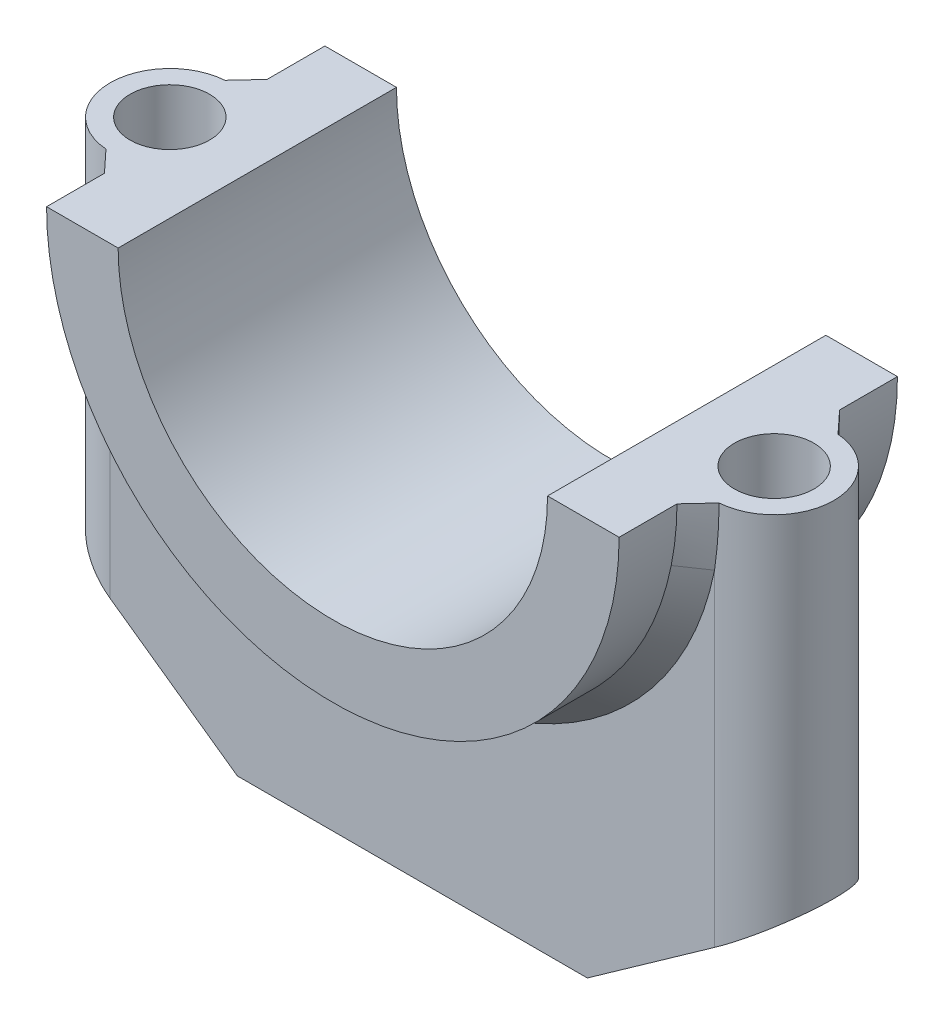
ISO-10303-21;
HEADER;
FILE_DESCRIPTION(('STEP AP214'),'2;1');
FILE_NAME('part.step','',(''),(''),'','','');
FILE_SCHEMA(('AUTOMOTIVE_DESIGN { 1 0 10303 214 1 1 1 1 }'));
ENDSEC;
DATA;
#1=APPLICATION_CONTEXT('core data for automotive mechanical design processes');
#2=APPLICATION_PROTOCOL_DEFINITION('international standard','automotive_design',2000,#1);
#3=PRODUCT_CONTEXT('',#1,'mechanical');
#4=PRODUCT('Part','Part','',(#3));
#5=PRODUCT_RELATED_PRODUCT_CATEGORY('part','',(#4));
#6=PRODUCT_DEFINITION_FORMATION('','',#4);
#7=PRODUCT_DEFINITION_CONTEXT('part definition',#1,'design');
#8=PRODUCT_DEFINITION('design','',#6,#7);
#9=PRODUCT_DEFINITION_SHAPE('','',#8);
#10=(LENGTH_UNIT() NAMED_UNIT(*) SI_UNIT(.MILLI.,.METRE.));
#11=(NAMED_UNIT(*) PLANE_ANGLE_UNIT() SI_UNIT($,.RADIAN.));
#12=(NAMED_UNIT(*) SI_UNIT($,.STERADIAN.) SOLID_ANGLE_UNIT());
#13=UNCERTAINTY_MEASURE_WITH_UNIT(LENGTH_MEASURE(1.E-05),#10,'distance_accuracy_value','');
#14=(GEOMETRIC_REPRESENTATION_CONTEXT(3) GLOBAL_UNCERTAINTY_ASSIGNED_CONTEXT((#13)) GLOBAL_UNIT_ASSIGNED_CONTEXT((#10,
#11,#12)) REPRESENTATION_CONTEXT('',''));
#15=CARTESIAN_POINT('',(0.,0.,0.));
#16=DIRECTION('',(0.,0.,1.));
#17=DIRECTION('',(1.,0.,0.));
#18=AXIS2_PLACEMENT_3D('',#15,#16,#17);
#19=CARTESIAN_POINT('',(0.,-59.7222410364215,7.5));
#20=DIRECTION('',(0.,1.,0.));
#21=DIRECTION('',(0.,0.,1.));
#22=AXIS2_PLACEMENT_3D('',#19,#20,#21);
#23=PLANE('',#22);
#24=DIRECTION('',(1.,0.,0.));
#25=VECTOR('',#24,1.);
#26=CARTESIAN_POINT('',(0.,-59.7222410364215,-7.5));
#27=LINE('',#26,#25);
#28=CARTESIAN_POINT('',(-58.7629469453342,-59.7222410364217,-7.5));
#29=VERTEX_POINT('',#28);
#30=CARTESIAN_POINT('',(-14.7629469453346,-59.7222410364215,-7.5));
#31=VERTEX_POINT('',#30);
#32=EDGE_CURVE('E174',#29,#31,#27,.T.);
#33=ORIENTED_EDGE('',*,*,#32,.T.);
#34=DIRECTION('',(0.,0.,1.));
#35=VECTOR('',#34,1.);
#36=CARTESIAN_POINT('',(-14.7629469453346,-59.7222410364215,-17.5));
#37=LINE('',#36,#35);
#38=CARTESIAN_POINT('',(-14.7629469453346,-59.7222410364215,7.5));
#39=VERTEX_POINT('',#38);
#40=EDGE_CURVE('E177',#31,#39,#37,.T.);
#41=ORIENTED_EDGE('',*,*,#40,.T.);
#42=DIRECTION('',(1.,0.,0.));
#43=VECTOR('',#42,1.);
#44=CARTESIAN_POINT('',(0.,-59.7222410364215,7.5));
#45=LINE('',#44,#43);
#46=CARTESIAN_POINT('',(-58.7629469453342,-59.7222410364217,7.5));
#47=VERTEX_POINT('',#46);
#48=EDGE_CURVE('E176',#47,#39,#45,.T.);
#49=ORIENTED_EDGE('',*,*,#48,.F.);
#50=DIRECTION('',(0.,0.,1.));
#51=VECTOR('',#50,1.);
#52=CARTESIAN_POINT('',(-58.7629469453342,-59.7222410364217,-17.5));
#53=LINE('',#52,#51);
#54=EDGE_CURVE('E160',#29,#47,#53,.T.);
#55=ORIENTED_EDGE('',*,*,#54,.F.);
#56=EDGE_LOOP('',(#33,#41,#49,#55));
#57=FACE_BOUND('',#56,.T.);
#58=ADVANCED_FACE('F38',(#57),#23,.F.);
#59=CARTESIAN_POINT('',(0.,0.27775896357847,7.5));
#60=DIRECTION('',(0.,1.,0.));
#61=DIRECTION('',(0.,0.,1.));
#62=AXIS2_PLACEMENT_3D('',#59,#60,#61);
#63=PLANE('',#62);
#64=CARTESIAN_POINT('',(-74.7629469453346,0.27775896357847,0.));
#65=DIRECTION('',(0.,1.,0.));
#66=DIRECTION('',(0.,0.,1.));
#67=AXIS2_PLACEMENT_3D('',#64,#65,#66);
#68=CIRCLE('',#67,5.);
#69=CARTESIAN_POINT('',(-74.7629469453346,0.27775896357847,5.));
#70=VERTEX_POINT('',#69);
#71=EDGE_CURVE('E208',#70,#70,#68,.T.);
#72=ORIENTED_EDGE('',*,*,#71,.F.);
#73=EDGE_LOOP('',(#72));
#74=FACE_BOUND('',#73,.T.);
#75=DIRECTION('',(0.,0.,-1.));
#76=VECTOR('',#75,1.);
#77=CARTESIAN_POINT('',(-72.7629469453346,0.27775896357847,17.5));
#78=LINE('',#77,#76);
#79=CARTESIAN_POINT('',(-72.7629469453346,0.27775896357847,-10.2225053511772));
#80=VERTEX_POINT('',#79);
#81=CARTESIAN_POINT('',(-72.7629469453346,0.27775896357847,-17.5));
#82=VERTEX_POINT('',#81);
#83=EDGE_CURVE('E252',#80,#82,#78,.T.);
#84=ORIENTED_EDGE('',*,*,#83,.F.);
#85=CARTESIAN_POINT('',(-75.3117237440311,0.277758963508197,-7.47988196427658));
#86=CARTESIAN_POINT('',(-72.7629422613691,0.277758963643756,-10.2225053511772));
#87=B_SPLINE_CURVE_WITH_KNOTS('',1,(#85,#86),.UNSPECIFIED.,.F.,.F.,(2,2),(0.,1.),.UNSPECIFIED.);
#88=CARTESIAN_POINT('',(-75.3117242557991,0.277758963571396,-7.47988893972493));
#89=VERTEX_POINT('',#88);
#90=EDGE_CURVE('E11',#80,#89,#87,.F.);
#91=ORIENTED_EDGE('',*,*,#90,.T.);
#92=CARTESIAN_POINT('',(-74.7629469453346,0.27775896357847,0.));
#93=DIRECTION('',(0.,1.,0.));
#94=DIRECTION('',(0.,0.,1.));
#95=AXIS2_PLACEMENT_3D('',#92,#93,#94);
#96=CIRCLE('',#95,7.50000000000001);
#97=CARTESIAN_POINT('',(-75.3117242557991,0.27775896357847,7.47988893972493));
#98=VERTEX_POINT('',#97);
#99=EDGE_CURVE('E360',#89,#98,#96,.T.);
#100=ORIENTED_EDGE('',*,*,#99,.T.);
#101=CARTESIAN_POINT('',(-72.7629422613691,0.277758963643759,10.2225053511773));
#102=CARTESIAN_POINT('',(-75.311723744031,0.277758963508194,7.47988196427658));
#103=B_SPLINE_CURVE_WITH_KNOTS('',1,(#101,#102),.UNSPECIFIED.,.F.,.F.,(2,2),(0.,1.),.UNSPECIFIED.);
#104=CARTESIAN_POINT('',(-72.7629469453346,0.27775896357847,10.2225053511773));
#105=VERTEX_POINT('',#104);
#106=EDGE_CURVE('E501',#98,#105,#103,.F.);
#107=ORIENTED_EDGE('',*,*,#106,.T.);
#108=CARTESIAN_POINT('',(-72.7629469453346,0.27775896357847,17.5));
#109=VERTEX_POINT('',#108);
#110=EDGE_CURVE('E188',#109,#105,#78,.T.);
#111=ORIENTED_EDGE('',*,*,#110,.F.);
#112=DIRECTION('',(1.,0.,0.));
#113=VECTOR('',#112,1.);
#114=CARTESIAN_POINT('',(0.,0.27775896357847,17.5));
#115=LINE('',#114,#113);
#116=CARTESIAN_POINT('',(-63.7629469453346,0.27775896357847,17.5));
#117=VERTEX_POINT('',#116);
#118=EDGE_CURVE('E220',#109,#117,#115,.T.);
#119=ORIENTED_EDGE('',*,*,#118,.T.);
#120=DIRECTION('',(0.,0.,-1.));
#121=VECTOR('',#120,1.);
#122=CARTESIAN_POINT('',(-63.7629469453346,0.27775896357847,17.5));
#123=LINE('',#122,#121);
#124=CARTESIAN_POINT('',(-63.7629469453346,0.27775896357847,-17.5));
#125=VERTEX_POINT('',#124);
#126=EDGE_CURVE('E184',#117,#125,#123,.T.);
#127=ORIENTED_EDGE('',*,*,#126,.T.);
#128=DIRECTION('',(1.,0.,0.));
#129=VECTOR('',#128,1.);
#130=CARTESIAN_POINT('',(0.,0.27775896357847,-17.5));
#131=LINE('',#130,#129);
#132=EDGE_CURVE('E230',#82,#125,#131,.T.);
#133=ORIENTED_EDGE('',*,*,#132,.F.);
#134=EDGE_LOOP('',(#84,#91,#100,#107,#111,#119,#127,#133));
#135=FACE_BOUND('',#134,.T.);
#136=ADVANCED_FACE('F317',(#74,#135),#63,.T.);
#137=CARTESIAN_POINT('',(1.2370530546655,0.27775896357847,-2.63677968348475E-13));
#138=DIRECTION('',(0.,1.,0.));
#139=DIRECTION('',(0.,0.,1.));
#140=AXIS2_PLACEMENT_3D('',#137,#138,#139);
#141=CIRCLE('',#140,5.00000000000001);
#142=CARTESIAN_POINT('',(1.2370530546655,0.27775896357847,4.99999999999974));
#143=VERTEX_POINT('',#142);
#144=EDGE_CURVE('E542',#143,#143,#141,.F.);
#145=ORIENTED_EDGE('',*,*,#144,.T.);
#146=EDGE_LOOP('',(#145));
#147=FACE_BOUND('',#146,.T.);
#148=CARTESIAN_POINT('',(1.2370530546655,0.27775896357847,-2.63677968348475E-13));
#149=DIRECTION('',(0.,1.,0.));
#150=DIRECTION('',(0.,0.,1.));
#151=AXIS2_PLACEMENT_3D('',#148,#149,#150);
#152=CIRCLE('',#151,7.50000000000002);
#153=CARTESIAN_POINT('',(1.78583036512984,0.27775896357847,-7.4798889397252));
#154=VERTEX_POINT('',#153);
#155=CARTESIAN_POINT('',(1.78583036512983,0.277758963571396,7.47988893972468));
#156=VERTEX_POINT('',#155);
#157=EDGE_CURVE('E203',#154,#156,#152,.F.);
#158=ORIENTED_EDGE('',*,*,#157,.F.);
#159=CARTESIAN_POINT('',(-0.762951629300119,0.277758963643762,-10.2225053511775));
#160=CARTESIAN_POINT('',(1.78582985336184,0.277758963508191,-7.47988196427685));
#161=B_SPLINE_CURVE_WITH_KNOTS('',1,(#159,#160),.UNSPECIFIED.,.F.,.F.,(2,2),(0.,1.),.UNSPECIFIED.);
#162=CARTESIAN_POINT('',(-0.76294694533463,0.27775896357847,-10.2225053511775));
#163=VERTEX_POINT('',#162);
#164=EDGE_CURVE('E52',#154,#163,#161,.F.);
#165=ORIENTED_EDGE('',*,*,#164,.T.);
#166=DIRECTION('',(0.,0.,-1.));
#167=VECTOR('',#166,1.);
#168=CARTESIAN_POINT('',(-0.76294694533463,0.27775896357847,17.5));
#169=LINE('',#168,#167);
#170=CARTESIAN_POINT('',(-0.76294694533463,0.27775896357847,-17.5));
#171=VERTEX_POINT('',#170);
#172=EDGE_CURVE('E239',#163,#171,#169,.T.);
#173=ORIENTED_EDGE('',*,*,#172,.T.);
#174=CARTESIAN_POINT('',(-9.76294694533464,0.27775896357847,-17.5));
#175=VERTEX_POINT('',#174);
#176=EDGE_CURVE('E221',#175,#171,#131,.T.);
#177=ORIENTED_EDGE('',*,*,#176,.F.);
#178=DIRECTION('',(0.,0.,-1.));
#179=VECTOR('',#178,1.);
#180=CARTESIAN_POINT('',(-9.76294694533464,0.27775896357847,17.5));
#181=LINE('',#180,#179);
#182=CARTESIAN_POINT('',(-9.76294694533464,0.27775896357847,17.5));
#183=VERTEX_POINT('',#182);
#184=EDGE_CURVE('E237',#183,#175,#181,.T.);
#185=ORIENTED_EDGE('',*,*,#184,.F.);
#186=CARTESIAN_POINT('',(-0.76294694533463,0.27775896357847,17.5));
#187=VERTEX_POINT('',#186);
#188=EDGE_CURVE('E225',#183,#187,#115,.T.);
#189=ORIENTED_EDGE('',*,*,#188,.T.);
#190=CARTESIAN_POINT('',(-0.76294694533463,0.27775896357847,10.222505351177));
#191=VERTEX_POINT('',#190);
#192=EDGE_CURVE('E248',#187,#191,#169,.T.);
#193=ORIENTED_EDGE('',*,*,#192,.T.);
#194=CARTESIAN_POINT('',(1.78582985336183,0.277758963508188,7.47988196427632));
#195=CARTESIAN_POINT('',(-0.762951629300114,0.277758963643765,10.222505351177));
#196=B_SPLINE_CURVE_WITH_KNOTS('',1,(#194,#195),.UNSPECIFIED.,.F.,.F.,(2,2),(0.,1.),.UNSPECIFIED.);
#197=EDGE_CURVE('E311',#191,#156,#196,.F.);
#198=ORIENTED_EDGE('',*,*,#197,.T.);
#199=EDGE_LOOP('',(#158,#165,#173,#177,#185,#189,#193,#198));
#200=FACE_BOUND('',#199,.T.);
#201=ADVANCED_FACE('F327',(#147,#200),#63,.T.);
#202=CARTESIAN_POINT('',(0.,0.,7.5));
#203=DIRECTION('',(0.,0.,1.));
#204=DIRECTION('',(1.,0.,0.));
#205=AXIS2_PLACEMENT_3D('',#202,#203,#204);
#206=PLANE('',#205);
#207=DIRECTION('',(0.,1.,0.));
#208=VECTOR('',#207,1.);
#209=CARTESIAN_POINT('',(1.2370530546655,-62.7222410364215,7.5));
#210=LINE('',#209,#208);
#211=CARTESIAN_POINT('',(1.2370530546655,-48.3928793342938,7.5));
#212=VERTEX_POINT('',#211);
#213=CARTESIAN_POINT('',(1.2370530546655,-7.30923648916767,7.5));
#214=VERTEX_POINT('',#213);
#215=EDGE_CURVE('E207',#212,#214,#210,.T.);
#216=ORIENTED_EDGE('',*,*,#215,.T.);
#217=CARTESIAN_POINT('',(-36.7629469453346,0.27775896357847,7.5));
#218=DIRECTION('',(0.,0.,1.));
#219=DIRECTION('',(1.,0.,0.));
#220=AXIS2_PLACEMENT_3D('',#217,#218,#219);
#221=CIRCLE('',#220,38.75);
#222=CARTESIAN_POINT('',(-74.7629469453346,-7.3092364891683,7.50000000000001));
#223=VERTEX_POINT('',#222);
#224=EDGE_CURVE('E382',#214,#223,#221,.F.);
#225=ORIENTED_EDGE('',*,*,#224,.T.);
#226=DIRECTION('',(0.,1.,0.));
#227=VECTOR('',#226,1.);
#228=CARTESIAN_POINT('',(-74.7629469453346,-62.7222410364215,7.50000000000001));
#229=LINE('',#228,#227);
#230=CARTESIAN_POINT('',(-74.7629469453346,-48.3928793342939,7.50000000000001));
#231=VERTEX_POINT('',#230);
#232=EDGE_CURVE('E231',#231,#223,#229,.T.);
#233=ORIENTED_EDGE('',*,*,#232,.F.);
#234=DIRECTION('',(-0.816120023544108,0.577882433692498,0.));
#235=VECTOR('',#234,1.);
#236=CARTESIAN_POINT('',(-47.7900633492799,-67.4919764848617,7.5));
#237=LINE('',#236,#235);
#238=EDGE_CURVE('E168',#47,#231,#237,.T.);
#239=ORIENTED_EDGE('',*,*,#238,.F.);
#240=ORIENTED_EDGE('',*,*,#48,.T.);
#241=DIRECTION('',(-0.816120023544105,-0.577882433692503,0.));
#242=VECTOR('',#241,1.);
#243=CARTESIAN_POINT('',(23.2362302564819,-32.8155896050077,7.5));
#244=LINE('',#243,#242);
#245=EDGE_CURVE('E545',#212,#39,#244,.T.);
#246=ORIENTED_EDGE('',*,*,#245,.F.);
#247=EDGE_LOOP('',(#216,#225,#233,#239,#240,#246));
#248=FACE_BOUND('',#247,.T.);
#249=ADVANCED_FACE('F583',(#248),#206,.T.);
#250=CARTESIAN_POINT('',(0.,0.,-7.5));
#251=DIRECTION('',(0.,0.,1.));
#252=DIRECTION('',(1.,0.,0.));
#253=AXIS2_PLACEMENT_3D('',#250,#251,#252);
#254=PLANE('',#253);
#255=DIRECTION('',(0.,1.,0.));
#256=VECTOR('',#255,1.);
#257=CARTESIAN_POINT('',(-74.7629469453346,-62.7222410364215,-7.50000000000001));
#258=LINE('',#257,#256);
#259=CARTESIAN_POINT('',(-74.7629469453346,-48.3928793342939,-7.50000000000001));
#260=VERTEX_POINT('',#259);
#261=CARTESIAN_POINT('',(-74.7629469453346,-7.3092364891684,-7.50000000000001));
#262=VERTEX_POINT('',#261);
#263=EDGE_CURVE('E198',#260,#262,#258,.T.);
#264=ORIENTED_EDGE('',*,*,#263,.T.);
#265=CARTESIAN_POINT('',(-36.7629469453346,0.27775896357847,-7.5));
#266=DIRECTION('',(0.,0.,1.));
#267=DIRECTION('',(1.,0.,0.));
#268=AXIS2_PLACEMENT_3D('',#265,#266,#267);
#269=CIRCLE('',#268,38.75);
#270=CARTESIAN_POINT('',(1.2370530546655,-7.30923648916777,-7.50000000000014));
#271=VERTEX_POINT('',#270);
#272=EDGE_CURVE('E437',#262,#271,#269,.T.);
#273=ORIENTED_EDGE('',*,*,#272,.T.);
#274=DIRECTION('',(0.,1.,0.));
#275=VECTOR('',#274,1.);
#276=CARTESIAN_POINT('',(1.2370530546655,-62.7222410364215,-7.50000000000014));
#277=LINE('',#276,#275);
#278=CARTESIAN_POINT('',(1.2370530546655,-48.3928793342938,-7.50000000000014));
#279=VERTEX_POINT('',#278);
#280=EDGE_CURVE('E186',#271,#279,#277,.F.);
#281=ORIENTED_EDGE('',*,*,#280,.T.);
#282=DIRECTION('',(-0.816120023544105,-0.577882433692503,0.));
#283=VECTOR('',#282,1.);
#284=CARTESIAN_POINT('',(23.2362302564819,-32.8155896050077,-7.5));
#285=LINE('',#284,#283);
#286=EDGE_CURVE('E183',#279,#31,#285,.T.);
#287=ORIENTED_EDGE('',*,*,#286,.T.);
#288=ORIENTED_EDGE('',*,*,#32,.F.);
#289=DIRECTION('',(-0.816120023544108,0.577882433692498,0.));
#290=VECTOR('',#289,1.);
#291=CARTESIAN_POINT('',(-47.7900633492799,-67.4919764848617,-7.5));
#292=LINE('',#291,#290);
#293=EDGE_CURVE('E156',#29,#260,#292,.T.);
#294=ORIENTED_EDGE('',*,*,#293,.T.);
#295=EDGE_LOOP('',(#264,#273,#281,#287,#288,#294));
#296=FACE_BOUND('',#295,.T.);
#297=ADVANCED_FACE('F181',(#296),#254,.F.);
#298=CARTESIAN_POINT('',(-36.7629469453346,0.27775896357847,17.5));
#299=DIRECTION('',(0.,0.,-1.));
#300=DIRECTION('',(-1.,0.,0.));
#301=AXIS2_PLACEMENT_3D('',#298,#299,#300);
#302=CYLINDRICAL_SURFACE('',#301,36.);
#303=ORIENTED_EDGE('',*,*,#172,.F.);
#304=CARTESIAN_POINT('',(-1.45972113888292,-6.77080455381157,-10.2500000000003));
#305=CARTESIAN_POINT('',(-1.21418745379677,-5.54082633957393,-10.2498352325676));
#306=CARTESIAN_POINT('',(-1.03484689699849,-4.30896596014024,-10.2405417093177));
#307=CARTESIAN_POINT('',(-0.804029656195131,-1.84159881846077,-10.2264360254272));
#308=CARTESIAN_POINT('',(-0.752569219962254,-0.606091664644366,-10.2215580710782));
#309=CARTESIAN_POINT('',(-0.764682291979195,0.63123024526962,-10.2226610220967));
#310=B_SPLINE_CURVE_WITH_KNOTS('',3,(#304,#305,#306,#307,#308,#309),.UNSPECIFIED.,.F.,.F.,(4,2,
4),(0.,0.00399278032048339,0.00798556064096678),.UNSPECIFIED.);
#311=CARTESIAN_POINT('',(-1.45972113888292,-6.77080455381158,-10.25));
#312=VERTEX_POINT('',#311);
#313=EDGE_CURVE('E59',#163,#312,#310,.F.);
#314=ORIENTED_EDGE('',*,*,#313,.T.);
#315=CARTESIAN_POINT('',(-36.7629469453346,0.27775896357847,-10.25));
#316=DIRECTION('',(0.,0.,1.));
#317=DIRECTION('',(1.,0.,0.));
#318=AXIS2_PLACEMENT_3D('',#315,#316,#317);
#319=CIRCLE('',#318,36.);
#320=CARTESIAN_POINT('',(-72.0661727517862,-6.77080455381216,-10.25));
#321=VERTEX_POINT('',#320);
#322=EDGE_CURVE('E65',#312,#321,#319,.F.);
#323=ORIENTED_EDGE('',*,*,#322,.T.);
#324=CARTESIAN_POINT('',(-72.7612115986901,0.631230245269651,-10.2226610220965));
#325=CARTESIAN_POINT('',(-72.773324670707,-0.606091664644478,-10.2215580710779));
#326=CARTESIAN_POINT('',(-72.7218642344741,-1.84159881846094,-10.2264360254269));
#327=CARTESIAN_POINT('',(-72.4910469936707,-4.30896596014064,-10.2405417093175));
#328=CARTESIAN_POINT('',(-72.3117064368724,-5.54082633957443,-10.2498352325674));
#329=CARTESIAN_POINT('',(-72.0661727517862,-6.77080455381216,-10.25));
#330=B_SPLINE_CURVE_WITH_KNOTS('',3,(#324,#325,#326,#327,#328,#329),.UNSPECIFIED.,.F.,.F.,(4,2,
4),(0.,0.00399278032048373,0.00798556064096746),.UNSPECIFIED.);
#331=EDGE_CURVE('E297',#321,#80,#330,.F.);
#332=ORIENTED_EDGE('',*,*,#331,.T.);
#333=ORIENTED_EDGE('',*,*,#83,.T.);
#334=CARTESIAN_POINT('',(-36.7629469453346,0.27775896357847,-17.5));
#335=DIRECTION('',(0.,0.,1.));
#336=DIRECTION('',(1.,0.,0.));
#337=AXIS2_PLACEMENT_3D('',#334,#335,#336);
#338=CIRCLE('',#337,36.);
#339=EDGE_CURVE('E234',#82,#171,#338,.T.);
#340=ORIENTED_EDGE('',*,*,#339,.T.);
#341=EDGE_LOOP('',(#303,#314,#323,#332,#333,#340));
#342=FACE_BOUND('',#341,.T.);
#343=ADVANCED_FACE('F278',(#342),#302,.T.);
#344=CARTESIAN_POINT('',(-36.7629469453346,0.27775896357847,17.5));
#345=DIRECTION('',(0.,0.,-1.));
#346=DIRECTION('',(-1.,0.,0.));
#347=AXIS2_PLACEMENT_3D('',#344,#345,#346);
#348=CYLINDRICAL_SURFACE('',#347,27.);
#349=CARTESIAN_POINT('',(-36.7629469453346,0.27775896357847,-17.5));
#350=DIRECTION('',(0.,0.,1.));
#351=DIRECTION('',(1.,0.,0.));
#352=AXIS2_PLACEMENT_3D('',#349,#350,#351);
#353=CIRCLE('',#352,27.);
#354=EDGE_CURVE('E227',#125,#175,#353,.T.);
#355=ORIENTED_EDGE('',*,*,#354,.F.);
#356=ORIENTED_EDGE('',*,*,#126,.F.);
#357=CARTESIAN_POINT('',(-36.7629469453346,0.27775896357847,17.5));
#358=DIRECTION('',(0.,0.,1.));
#359=DIRECTION('',(1.,0.,0.));
#360=AXIS2_PLACEMENT_3D('',#357,#358,#359);
#361=CIRCLE('',#360,27.);
#362=EDGE_CURVE('E217',#117,#183,#361,.T.);
#363=ORIENTED_EDGE('',*,*,#362,.T.);
#364=ORIENTED_EDGE('',*,*,#184,.T.);
#365=EDGE_LOOP('',(#355,#356,#363,#364));
#366=FACE_BOUND('',#365,.T.);
#367=ADVANCED_FACE('F277',(#366),#348,.F.);
#368=ORIENTED_EDGE('',*,*,#110,.T.);
#369=CARTESIAN_POINT('',(-72.0661727517863,-6.77080455381207,10.25));
#370=CARTESIAN_POINT('',(-72.3117064368724,-5.54082633957436,10.2498352325674));
#371=CARTESIAN_POINT('',(-72.4910469936707,-4.30896596014058,10.2405417093175));
#372=CARTESIAN_POINT('',(-72.7218642344741,-1.84159881846094,10.2264360254269));
#373=CARTESIAN_POINT('',(-72.773324670707,-0.606091664644462,10.2215580710779));
#374=CARTESIAN_POINT('',(-72.7612115986901,0.631230245269645,10.2226610220965));
#375=B_SPLINE_CURVE_WITH_KNOTS('',3,(#369,#370,#371,#372,#373,#374),.UNSPECIFIED.,.F.,.F.,(4,2,
4),(0.,0.00399278032048367,0.00798556064096735),.UNSPECIFIED.);
#376=CARTESIAN_POINT('',(-72.0661727517863,-6.77080455381207,10.25));
#377=VERTEX_POINT('',#376);
#378=EDGE_CURVE('E491',#105,#377,#375,.F.);
#379=ORIENTED_EDGE('',*,*,#378,.T.);
#380=CARTESIAN_POINT('',(-36.7629469453346,0.27775896357847,10.25));
#381=DIRECTION('',(0.,0.,1.));
#382=DIRECTION('',(1.,0.,0.));
#383=AXIS2_PLACEMENT_3D('',#380,#381,#382);
#384=CIRCLE('',#383,36.);
#385=CARTESIAN_POINT('',(-1.4597211388829,-6.77080455381148,10.2499999999998));
#386=VERTEX_POINT('',#385);
#387=EDGE_CURVE('E264',#377,#386,#384,.T.);
#388=ORIENTED_EDGE('',*,*,#387,.T.);
#389=CARTESIAN_POINT('',(-0.764682291979184,0.63123024526962,10.2226610220962));
#390=CARTESIAN_POINT('',(-0.752569219962267,-0.606091664644342,10.2215580710777));
#391=CARTESIAN_POINT('',(-0.804029656195131,-1.84159881846074,10.2264360254267));
#392=CARTESIAN_POINT('',(-1.03484689699847,-4.30896596014018,10.2405417093172));
#393=CARTESIAN_POINT('',(-1.21418745379676,-5.54082633957385,10.2498352325671));
#394=CARTESIAN_POINT('',(-1.4597211388829,-6.77080455381148,10.2499999999998));
#395=B_SPLINE_CURVE_WITH_KNOTS('',3,(#389,#390,#391,#392,#393,#394),.UNSPECIFIED.,.F.,.F.,(4,2,
4),(0.,0.00399278032048334,0.00798556064096668),.UNSPECIFIED.);
#396=EDGE_CURVE('E260',#386,#191,#395,.F.);
#397=ORIENTED_EDGE('',*,*,#396,.T.);
#398=ORIENTED_EDGE('',*,*,#192,.F.);
#399=CARTESIAN_POINT('',(-36.7629469453346,0.27775896357847,17.5));
#400=DIRECTION('',(0.,0.,1.));
#401=DIRECTION('',(1.,0.,0.));
#402=AXIS2_PLACEMENT_3D('',#399,#400,#401);
#403=CIRCLE('',#402,36.);
#404=EDGE_CURVE('E224',#109,#187,#403,.T.);
#405=ORIENTED_EDGE('',*,*,#404,.F.);
#406=EDGE_LOOP('',(#368,#379,#388,#397,#398,#405));
#407=FACE_BOUND('',#406,.T.);
#408=ADVANCED_FACE('F266',(#407),#302,.T.);
#409=CARTESIAN_POINT('',(0.,0.,17.5));
#410=DIRECTION('',(0.,0.,1.));
#411=DIRECTION('',(1.,0.,0.));
#412=AXIS2_PLACEMENT_3D('',#409,#410,#411);
#413=PLANE('',#412);
#414=ORIENTED_EDGE('',*,*,#362,.F.);
#415=ORIENTED_EDGE('',*,*,#118,.F.);
#416=ORIENTED_EDGE('',*,*,#404,.T.);
#417=ORIENTED_EDGE('',*,*,#188,.F.);
#418=EDGE_LOOP('',(#414,#415,#416,#417));
#419=FACE_BOUND('',#418,.T.);
#420=ADVANCED_FACE('F276',(#419),#413,.T.);
#421=CARTESIAN_POINT('',(0.,0.,-17.5));
#422=DIRECTION('',(0.,0.,1.));
#423=DIRECTION('',(1.,0.,0.));
#424=AXIS2_PLACEMENT_3D('',#421,#422,#423);
#425=PLANE('',#424);
#426=ORIENTED_EDGE('',*,*,#354,.T.);
#427=ORIENTED_EDGE('',*,*,#176,.T.);
#428=ORIENTED_EDGE('',*,*,#339,.F.);
#429=ORIENTED_EDGE('',*,*,#132,.T.);
#430=EDGE_LOOP('',(#426,#427,#428,#429));
#431=FACE_BOUND('',#430,.T.);
#432=ADVANCED_FACE('F279',(#431),#425,.F.);
#433=CARTESIAN_POINT('',(1.2370530546655,-62.7222410364215,-2.63677968348475E-13));
#434=DIRECTION('',(0.,1.,0.));
#435=DIRECTION('',(0.,0.,1.));
#436=AXIS2_PLACEMENT_3D('',#433,#434,#435);
#437=CYLINDRICAL_SURFACE('',#436,7.50000000000002);
#438=ORIENTED_EDGE('',*,*,#157,.T.);
#439=CARTESIAN_POINT('',(1.2370530546655,-7.30923648916767,7.49999999999975));
#440=CARTESIAN_POINT('',(1.4304357842811,-5.9853016057869,7.49987943846366));
#441=CARTESIAN_POINT('',(1.57168469881688,-4.65934077499296,7.49307929947813));
#442=CARTESIAN_POINT('',(1.75347673220461,-2.00349421029782,7.48275806740748));
#443=CARTESIAN_POINT('',(1.7940070558479,-0.673608032078065,7.47918883249578));
#444=CARTESIAN_POINT('',(1.78446678063133,0.658231523732136,7.47999586982643));
#445=B_SPLINE_CURVE_WITH_KNOTS('',3,(#439,#440,#441,#442,#443,#444),.UNSPECIFIED.,.F.,.F.,(4,2,
4),(0.,0.00399278032048334,0.00798556064096668),.UNSPECIFIED.);
#446=EDGE_CURVE('E828',#156,#214,#445,.F.);
#447=ORIENTED_EDGE('',*,*,#446,.T.);
#448=ORIENTED_EDGE('',*,*,#215,.F.);
#449=CARTESIAN_POINT('',(1.2370530546655,-48.3928793342938,-2.63677968348475E-13));
#450=DIRECTION('',(-0.577882433692503,0.816120023544105,0.));
#451=DIRECTION('',(0.816120023544105,0.577882433692503,0.));
#452=AXIS2_PLACEMENT_3D('',#449,#450,#451);
#453=ELLIPSE('',#452,9.18982476061587,7.50000000000002);
#454=EDGE_CURVE('E550',#212,#279,#453,.T.);
#455=ORIENTED_EDGE('',*,*,#454,.T.);
#456=ORIENTED_EDGE('',*,*,#280,.F.);
#457=CARTESIAN_POINT('',(1.78446678063134,0.658231523732136,-7.47999586982696));
#458=CARTESIAN_POINT('',(1.79400705584793,-0.673608032078068,-7.47918883249631));
#459=CARTESIAN_POINT('',(1.75347673220463,-2.00349421029786,-7.48275806740801));
#460=CARTESIAN_POINT('',(1.57168469881689,-4.65934077499303,-7.49307929947866));
#461=CARTESIAN_POINT('',(1.43043578428111,-5.98530160578699,-7.49987943846419));
#462=CARTESIAN_POINT('',(1.2370530546655,-7.30923648916777,-7.50000000000028));
#463=B_SPLINE_CURVE_WITH_KNOTS('',3,(#457,#458,#459,#460,#461,#462),.UNSPECIFIED.,.F.,.F.,(4,2,
4),(0.,0.00399278032048339,0.00798556064096678),.UNSPECIFIED.);
#464=EDGE_CURVE('E775',#271,#154,#463,.F.);
#465=ORIENTED_EDGE('',*,*,#464,.T.);
#466=EDGE_LOOP('',(#438,#447,#448,#455,#456,#465));
#467=FACE_BOUND('',#466,.T.);
#468=ADVANCED_FACE('F527',(#467),#437,.T.);
#469=CARTESIAN_POINT('',(-74.7629469453346,-62.7222410364215,0.));
#470=DIRECTION('',(0.,1.,0.));
#471=DIRECTION('',(0.,0.,1.));
#472=AXIS2_PLACEMENT_3D('',#469,#470,#471);
#473=CYLINDRICAL_SURFACE('',#472,7.50000000000001);
#474=ORIENTED_EDGE('',*,*,#232,.T.);
#475=CARTESIAN_POINT('',(-75.3103606713006,0.658231523732164,7.47999586982669));
#476=CARTESIAN_POINT('',(-75.3199009465171,-0.673608032078146,7.47918883249604));
#477=CARTESIAN_POINT('',(-75.2793706228738,-2.00349421029801,7.48275806740774));
#478=CARTESIAN_POINT('',(-75.0975785894861,-4.65934077499338,7.49307929947839));
#479=CARTESIAN_POINT('',(-74.9563296749503,-5.98530160578742,7.49987943846392));
#480=CARTESIAN_POINT('',(-74.7629469453346,-7.3092364891683,7.50000000000001));
#481=B_SPLINE_CURVE_WITH_KNOTS('',3,(#475,#476,#477,#478,#479,#480),.UNSPECIFIED.,.F.,.F.,(4,2,
4),(0.,0.00399278032048367,0.00798556064096735),.UNSPECIFIED.);
#482=EDGE_CURVE('E373',#223,#98,#481,.F.);
#483=ORIENTED_EDGE('',*,*,#482,.T.);
#484=ORIENTED_EDGE('',*,*,#99,.F.);
#485=CARTESIAN_POINT('',(-74.7629469453346,-7.3092364891684,-7.50000000000001));
#486=CARTESIAN_POINT('',(-74.9563296749503,-5.98530160578751,-7.49987943846392));
#487=CARTESIAN_POINT('',(-75.0975785894861,-4.65934077499345,-7.49307929947839));
#488=CARTESIAN_POINT('',(-75.2793706228739,-2.00349421029804,-7.48275806740774));
#489=CARTESIAN_POINT('',(-75.3199009465172,-0.673608032078164,-7.47918883249604));
#490=CARTESIAN_POINT('',(-75.3103606713006,0.658231523732178,-7.47999586982669));
#491=B_SPLINE_CURVE_WITH_KNOTS('',3,(#485,#486,#487,#488,#489,#490),.UNSPECIFIED.,.F.,.F.,(4,2,
4),(0.,0.00399278032048373,0.00798556064096746),.UNSPECIFIED.);
#492=EDGE_CURVE('E370',#89,#262,#491,.F.);
#493=ORIENTED_EDGE('',*,*,#492,.T.);
#494=ORIENTED_EDGE('',*,*,#263,.F.);
#495=CARTESIAN_POINT('',(-74.7629469453346,-48.3928793342939,0.));
#496=DIRECTION('',(0.577882433692498,0.816120023544108,0.));
#497=DIRECTION('',(-0.816120023544108,0.577882433692498,0.));
#498=AXIS2_PLACEMENT_3D('',#495,#496,#497);
#499=ELLIPSE('',#498,9.18982476061582,7.50000000000001);
#500=EDGE_CURVE('E163',#231,#260,#499,.F.);
#501=ORIENTED_EDGE('',*,*,#500,.F.);
#502=EDGE_LOOP('',(#474,#483,#484,#493,#494,#501));
#503=FACE_BOUND('',#502,.T.);
#504=ADVANCED_FACE('F369',(#503),#473,.T.);
#505=CARTESIAN_POINT('',(1.2370530546655,-62.7222410364215,-2.63677968348475E-13));
#506=DIRECTION('',(0.,1.,0.));
#507=DIRECTION('',(0.,0.,1.));
#508=AXIS2_PLACEMENT_3D('',#505,#506,#507);
#509=CYLINDRICAL_SURFACE('',#508,5.00000000000001);
#510=CARTESIAN_POINT('',(1.2370530546655,-48.3928793342938,-2.63677968348475E-13));
#511=DIRECTION('',(-0.577882433692503,0.816120023544105,0.));
#512=DIRECTION('',(0.816120023544105,0.577882433692503,0.));
#513=AXIS2_PLACEMENT_3D('',#510,#511,#512);
#514=ELLIPSE('',#513,6.12654984041057,5.00000000000001);
#515=CARTESIAN_POINT('',(6.2370530546655,-44.852453802379,-2.63677968348475E-13));
#516=VERTEX_POINT('',#515);
#517=EDGE_CURVE('E253',#516,#516,#514,.T.);
#518=ORIENTED_EDGE('',*,*,#517,.F.);
#519=EDGE_LOOP('',(#518));
#520=FACE_BOUND('',#519,.T.);
#521=ORIENTED_EDGE('',*,*,#144,.F.);
#522=EDGE_LOOP('',(#521));
#523=FACE_BOUND('',#522,.T.);
#524=ADVANCED_FACE('F526',(#520,#523),#509,.F.);
#525=CARTESIAN_POINT('',(-74.7629469453346,-62.7222410364215,0.));
#526=DIRECTION('',(0.,1.,0.));
#527=DIRECTION('',(0.,0.,1.));
#528=AXIS2_PLACEMENT_3D('',#525,#526,#527);
#529=CYLINDRICAL_SURFACE('',#528,5.);
#530=CARTESIAN_POINT('',(-74.7629469453346,-48.3928793342939,0.));
#531=DIRECTION('',(0.577882433692498,0.816120023544108,0.));
#532=DIRECTION('',(-0.816120023544108,0.577882433692498,0.));
#533=AXIS2_PLACEMENT_3D('',#530,#531,#532);
#534=ELLIPSE('',#533,6.12654984041054,5.);
#535=CARTESIAN_POINT('',(-79.7629469453346,-44.8524538023791,0.));
#536=VERTEX_POINT('',#535);
#537=EDGE_CURVE('E554',#536,#536,#534,.F.);
#538=ORIENTED_EDGE('',*,*,#537,.T.);
#539=EDGE_LOOP('',(#538));
#540=FACE_BOUND('',#539,.T.);
#541=ORIENTED_EDGE('',*,*,#71,.T.);
#542=EDGE_LOOP('',(#541));
#543=FACE_BOUND('',#542,.T.);
#544=ADVANCED_FACE('F559',(#540,#543),#529,.F.);
#545=CARTESIAN_POINT('',(-58.7629469453342,-59.7222410364217,-17.5));
#546=DIRECTION('',(0.577882433692498,0.816120023544108,0.));
#547=DIRECTION('',(-0.816120023544108,0.577882433692498,0.));
#548=AXIS2_PLACEMENT_3D('',#545,#546,#547);
#549=PLANE('',#548);
#550=ORIENTED_EDGE('',*,*,#238,.T.);
#551=ORIENTED_EDGE('',*,*,#500,.T.);
#552=ORIENTED_EDGE('',*,*,#293,.F.);
#553=ORIENTED_EDGE('',*,*,#54,.T.);
#554=EDGE_LOOP('',(#550,#551,#552,#553));
#555=FACE_BOUND('',#554,.T.);
#556=ORIENTED_EDGE('',*,*,#537,.F.);
#557=EDGE_LOOP('',(#556));
#558=FACE_BOUND('',#557,.T.);
#559=ADVANCED_FACE('F158',(#555,#558),#549,.F.);
#560=CARTESIAN_POINT('',(-14.7629469453346,-59.7222410364215,-17.5));
#561=DIRECTION('',(-0.577882433692503,0.816120023544105,0.));
#562=DIRECTION('',(-0.816120023544105,-0.577882433692503,0.));
#563=AXIS2_PLACEMENT_3D('',#560,#561,#562);
#564=PLANE('',#563);
#565=ORIENTED_EDGE('',*,*,#245,.T.);
#566=ORIENTED_EDGE('',*,*,#40,.F.);
#567=ORIENTED_EDGE('',*,*,#286,.F.);
#568=ORIENTED_EDGE('',*,*,#454,.F.);
#569=EDGE_LOOP('',(#565,#566,#567,#568));
#570=FACE_BOUND('',#569,.T.);
#571=ORIENTED_EDGE('',*,*,#517,.T.);
#572=EDGE_LOOP('',(#571));
#573=FACE_BOUND('',#572,.T.);
#574=ADVANCED_FACE('F562',(#570,#573),#564,.F.);
#575=CARTESIAN_POINT('',(-1.4597211388829,-6.77080455381148,10.2499999999998));
#576=CARTESIAN_POINT('',(-1.21418745379676,-5.54082633957385,10.2498352325671));
#577=CARTESIAN_POINT('',(-1.03484689699847,-4.30896596014018,10.2405417093172));
#578=CARTESIAN_POINT('',(-0.804029656195131,-1.84159881846074,10.2264360254267));
#579=CARTESIAN_POINT('',(-0.752569219962267,-0.606091664644342,10.2215580710777));
#580=CARTESIAN_POINT('',(-0.764682291979184,0.63123024526962,10.2226610220962));
#581=CARTESIAN_POINT('',(1.2370530546655,-7.30923648916767,7.49999999999975));
#582=CARTESIAN_POINT('',(1.4304357842811,-5.9853016057869,7.49987943846366));
#583=CARTESIAN_POINT('',(1.57168469881688,-4.65934077499296,7.49307929947813));
#584=CARTESIAN_POINT('',(1.75347673220461,-2.00349421029782,7.48275806740748));
#585=CARTESIAN_POINT('',(1.7940070558479,-0.673608032078065,7.47918883249578));
#586=CARTESIAN_POINT('',(1.78446678063133,0.658231523732136,7.47999586982643));
#587=B_SPLINE_SURFACE_WITH_KNOTS('',1,3,((#575,#576,#577,#578,#579,#580),(#581,#582,#583,#584,
#585,#586)),.UNSPECIFIED.,.F.,.F.,.F.,(2,2),(4,2,4),(0.,1.),(0.,0.00399278032048334,
0.00798556064096668),.UNSPECIFIED.);
#588=CARTESIAN_POINT('',(-1.4597211388829,-6.77080455381148,10.2499999999998));
#589=CARTESIAN_POINT('',(1.2370530546655,-7.30923648916767,7.49999999999975));
#590=B_SPLINE_CURVE_WITH_KNOTS('',1,(#588,#589),.UNSPECIFIED.,.F.,.F.,(2,2),(0.,1.),.UNSPECIFIED.);
#591=EDGE_CURVE('E178',#214,#386,#590,.F.);
#592=ORIENTED_EDGE('',*,*,#197,.F.);
#593=ORIENTED_EDGE('',*,*,#396,.F.);
#594=ORIENTED_EDGE('',*,*,#591,.F.);
#595=ORIENTED_EDGE('',*,*,#446,.F.);
#596=EDGE_LOOP('',(#592,#593,#594,#595));
#597=FACE_BOUND('',#596,.T.);
#598=ADVANCED_FACE('F408',(#597),#587,.T.);
#599=CARTESIAN_POINT('',(-36.7629469453346,0.27775896357847,10.25));
#600=DIRECTION('',(0.,0.,-1.));
#601=DIRECTION('',(-1.,0.,0.));
#602=AXIS2_PLACEMENT_3D('',#599,#600,#601);
#603=CONICAL_SURFACE('',#602,36.,0.785398163397443);
#604=ORIENTED_EDGE('',*,*,#591,.T.);
#605=ORIENTED_EDGE('',*,*,#387,.F.);
#606=CARTESIAN_POINT('',(-74.7629469453346,-7.3092364891683,7.50000000000001));
#607=CARTESIAN_POINT('',(-72.0661727517863,-6.77080455381207,10.25));
#608=B_SPLINE_CURVE_WITH_KNOTS('',1,(#606,#607),.UNSPECIFIED.,.F.,.F.,(2,2),(0.,1.),.UNSPECIFIED.);
#609=EDGE_CURVE('E439',#223,#377,#608,.T.);
#610=ORIENTED_EDGE('',*,*,#609,.F.);
#611=ORIENTED_EDGE('',*,*,#224,.F.);
#612=EDGE_LOOP('',(#604,#605,#610,#611));
#613=FACE_BOUND('',#612,.T.);
#614=ADVANCED_FACE('F450',(#613),#603,.T.);
#615=CARTESIAN_POINT('',(-72.7612115986901,0.631230245269645,10.2226610220965));
#616=CARTESIAN_POINT('',(-72.773324670707,-0.606091664644462,10.2215580710779));
#617=CARTESIAN_POINT('',(-72.7218642344741,-1.84159881846094,10.2264360254269));
#618=CARTESIAN_POINT('',(-72.4910469936707,-4.30896596014058,10.2405417093175));
#619=CARTESIAN_POINT('',(-72.3117064368724,-5.54082633957436,10.2498352325674));
#620=CARTESIAN_POINT('',(-72.0661727517863,-6.77080455381207,10.25));
#621=CARTESIAN_POINT('',(-75.3103606713006,0.658231523732164,7.47999586982669));
#622=CARTESIAN_POINT('',(-75.3199009465171,-0.673608032078146,7.47918883249604));
#623=CARTESIAN_POINT('',(-75.2793706228738,-2.00349421029801,7.48275806740774));
#624=CARTESIAN_POINT('',(-75.0975785894861,-4.65934077499338,7.49307929947839));
#625=CARTESIAN_POINT('',(-74.9563296749503,-5.98530160578742,7.49987943846392));
#626=CARTESIAN_POINT('',(-74.7629469453346,-7.3092364891683,7.50000000000001));
#627=B_SPLINE_SURFACE_WITH_KNOTS('',1,3,((#615,#616,#617,#618,#619,#620),(#621,#622,#623,#624,
#625,#626)),.UNSPECIFIED.,.F.,.F.,.F.,(2,2),(4,2,4),(0.,1.),(0.,0.00399278032048367,
0.00798556064096735),.UNSPECIFIED.);
#628=ORIENTED_EDGE('',*,*,#106,.F.);
#629=ORIENTED_EDGE('',*,*,#482,.F.);
#630=ORIENTED_EDGE('',*,*,#609,.T.);
#631=ORIENTED_EDGE('',*,*,#378,.F.);
#632=EDGE_LOOP('',(#628,#629,#630,#631));
#633=FACE_BOUND('',#632,.T.);
#634=ADVANCED_FACE('F474',(#633),#627,.T.);
#635=CARTESIAN_POINT('',(1.2370530546655,-7.30923648916777,-7.50000000000028));
#636=CARTESIAN_POINT('',(1.43043578428111,-5.98530160578699,-7.49987943846419));
#637=CARTESIAN_POINT('',(1.57168469881689,-4.65934077499303,-7.49307929947866));
#638=CARTESIAN_POINT('',(1.75347673220463,-2.00349421029786,-7.48275806740801));
#639=CARTESIAN_POINT('',(1.79400705584793,-0.673608032078068,-7.47918883249631));
#640=CARTESIAN_POINT('',(1.78446678063134,0.658231523732136,-7.47999586982696));
#641=CARTESIAN_POINT('',(-1.45972113888292,-6.77080455381157,-10.2500000000003));
#642=CARTESIAN_POINT('',(-1.21418745379677,-5.54082633957393,-10.2498352325676));
#643=CARTESIAN_POINT('',(-1.03484689699849,-4.30896596014024,-10.2405417093177));
#644=CARTESIAN_POINT('',(-0.804029656195131,-1.84159881846077,-10.2264360254272));
#645=CARTESIAN_POINT('',(-0.752569219962254,-0.606091664644366,-10.2215580710782));
#646=CARTESIAN_POINT('',(-0.764682291979195,0.63123024526962,-10.2226610220967));
#647=B_SPLINE_SURFACE_WITH_KNOTS('',1,3,((#635,#636,#637,#638,#639,#640),(#641,#642,#643,#644,
#645,#646)),.UNSPECIFIED.,.F.,.F.,.F.,(2,2),(4,2,4),(0.,1.),(0.,0.00399278032048339,
0.00798556064096678),.UNSPECIFIED.);
#648=CARTESIAN_POINT('',(1.2370530546655,-7.30923648916777,-7.50000000000028));
#649=CARTESIAN_POINT('',(-1.45972113888292,-6.77080455381157,-10.2500000000003));
#650=B_SPLINE_CURVE_WITH_KNOTS('',1,(#648,#649),.UNSPECIFIED.,.F.,.F.,(2,2),(0.,1.),.UNSPECIFIED.);
#651=EDGE_CURVE('E438',#312,#271,#650,.F.);
#652=ORIENTED_EDGE('',*,*,#164,.F.);
#653=ORIENTED_EDGE('',*,*,#464,.F.);
#654=ORIENTED_EDGE('',*,*,#651,.F.);
#655=ORIENTED_EDGE('',*,*,#313,.F.);
#656=EDGE_LOOP('',(#652,#653,#654,#655));
#657=FACE_BOUND('',#656,.T.);
#658=ADVANCED_FACE('F41',(#657),#647,.T.);
#659=CARTESIAN_POINT('',(-36.7629469453346,0.27775896357847,-7.5));
#660=DIRECTION('',(0.,0.,1.));
#661=DIRECTION('',(1.,0.,0.));
#662=AXIS2_PLACEMENT_3D('',#659,#660,#661);
#663=CONICAL_SURFACE('',#662,38.75,0.785398163397452);
#664=ORIENTED_EDGE('',*,*,#651,.T.);
#665=ORIENTED_EDGE('',*,*,#272,.F.);
#666=CARTESIAN_POINT('',(-72.0661727517862,-6.77080455381216,-10.25));
#667=CARTESIAN_POINT('',(-74.7629469453346,-7.3092364891684,-7.50000000000001));
#668=B_SPLINE_CURVE_WITH_KNOTS('',1,(#666,#667),.UNSPECIFIED.,.F.,.F.,(2,2),(0.,1.),.UNSPECIFIED.);
#669=EDGE_CURVE('E379',#321,#262,#668,.T.);
#670=ORIENTED_EDGE('',*,*,#669,.F.);
#671=ORIENTED_EDGE('',*,*,#322,.F.);
#672=EDGE_LOOP('',(#664,#665,#670,#671));
#673=FACE_BOUND('',#672,.T.);
#674=ADVANCED_FACE('F406',(#673),#663,.T.);
#675=CARTESIAN_POINT('',(-75.3103606713006,0.658231523732178,-7.47999586982669));
#676=CARTESIAN_POINT('',(-75.3199009465172,-0.673608032078164,-7.47918883249604));
#677=CARTESIAN_POINT('',(-75.2793706228739,-2.00349421029804,-7.48275806740774));
#678=CARTESIAN_POINT('',(-75.0975785894861,-4.65934077499345,-7.49307929947839));
#679=CARTESIAN_POINT('',(-74.9563296749503,-5.98530160578751,-7.49987943846392));
#680=CARTESIAN_POINT('',(-74.7629469453346,-7.3092364891684,-7.50000000000001));
#681=CARTESIAN_POINT('',(-72.7612115986901,0.631230245269651,-10.2226610220965));
#682=CARTESIAN_POINT('',(-72.773324670707,-0.606091664644478,-10.2215580710779));
#683=CARTESIAN_POINT('',(-72.7218642344741,-1.84159881846094,-10.2264360254269));
#684=CARTESIAN_POINT('',(-72.4910469936707,-4.30896596014064,-10.2405417093175));
#685=CARTESIAN_POINT('',(-72.3117064368724,-5.54082633957443,-10.2498352325674));
#686=CARTESIAN_POINT('',(-72.0661727517862,-6.77080455381216,-10.25));
#687=B_SPLINE_SURFACE_WITH_KNOTS('',1,3,((#675,#676,#677,#678,#679,#680),(#681,#682,#683,#684,
#685,#686)),.UNSPECIFIED.,.F.,.F.,.F.,(2,2),(4,2,4),(0.,1.),(0.,0.00399278032048373,
0.00798556064096746),.UNSPECIFIED.);
#688=ORIENTED_EDGE('',*,*,#90,.F.);
#689=ORIENTED_EDGE('',*,*,#331,.F.);
#690=ORIENTED_EDGE('',*,*,#669,.T.);
#691=ORIENTED_EDGE('',*,*,#492,.F.);
#692=EDGE_LOOP('',(#688,#689,#690,#691));
#693=FACE_BOUND('',#692,.T.);
#694=ADVANCED_FACE('F377',(#693),#687,.T.);
#695=CLOSED_SHELL('',(#58,#136,#201,#249,#297,#343,#367,#408,#420,#432,#468,#504,#524,#544,#559,
#574,#598,#614,#634,#658,#674,#694));
#696=MANIFOLD_SOLID_BREP('B2',#695);
#697=ADVANCED_BREP_SHAPE_REPRESENTATION('',(#18,#696),#14);
#698=SHAPE_DEFINITION_REPRESENTATION(#9,#697);
ENDSEC;
END-ISO-10303-21;
